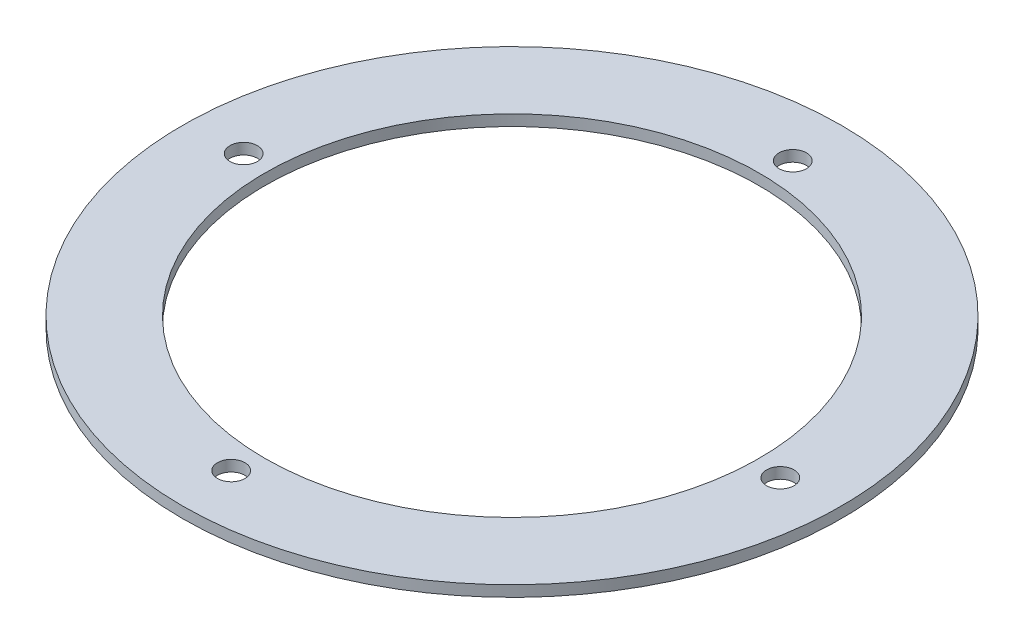
ISO-10303-21;
HEADER;
FILE_DESCRIPTION(('STEP AP214'),'2;1');
FILE_NAME('part.step','',(''),(''),'','','');
FILE_SCHEMA(('AUTOMOTIVE_DESIGN { 1 0 10303 214 1 1 1 1 }'));
ENDSEC;
DATA;
#1=APPLICATION_CONTEXT('core data for automotive mechanical design processes');
#2=APPLICATION_PROTOCOL_DEFINITION('international standard','automotive_design',2000,#1);
#3=PRODUCT_CONTEXT('',#1,'mechanical');
#4=PRODUCT('Part','Part','',(#3));
#5=PRODUCT_RELATED_PRODUCT_CATEGORY('part','',(#4));
#6=PRODUCT_DEFINITION_FORMATION('','',#4);
#7=PRODUCT_DEFINITION_CONTEXT('part definition',#1,'design');
#8=PRODUCT_DEFINITION('design','',#6,#7);
#9=PRODUCT_DEFINITION_SHAPE('','',#8);
#10=(LENGTH_UNIT() NAMED_UNIT(*) SI_UNIT(.MILLI.,.METRE.));
#11=(NAMED_UNIT(*) PLANE_ANGLE_UNIT() SI_UNIT($,.RADIAN.));
#12=(NAMED_UNIT(*) SI_UNIT($,.STERADIAN.) SOLID_ANGLE_UNIT());
#13=UNCERTAINTY_MEASURE_WITH_UNIT(LENGTH_MEASURE(1.E-05),#10,'distance_accuracy_value','');
#14=(GEOMETRIC_REPRESENTATION_CONTEXT(3) GLOBAL_UNCERTAINTY_ASSIGNED_CONTEXT((#13)) GLOBAL_UNIT_ASSIGNED_CONTEXT((#10,
#11,#12)) REPRESENTATION_CONTEXT('',''));
#15=CARTESIAN_POINT('',(0.,0.,0.));
#16=DIRECTION('',(0.,0.,1.));
#17=DIRECTION('',(1.,0.,0.));
#18=AXIS2_PLACEMENT_3D('',#15,#16,#17);
#19=CARTESIAN_POINT('',(0.,2.,0.));
#20=DIRECTION('',(0.,1.,0.));
#21=DIRECTION('',(0.,0.,1.));
#22=AXIS2_PLACEMENT_3D('',#19,#20,#21);
#23=PLANE('',#22);
#24=CARTESIAN_POINT('',(-1.13342940451287,2.,49.9871517270687));
#25=DIRECTION('',(0.,1.,0.));
#26=DIRECTION('',(0.,0.,1.));
#27=AXIS2_PLACEMENT_3D('',#24,#25,#26);
#28=CIRCLE('',#27,2.50000000000302);
#29=CARTESIAN_POINT('',(-1.13342940451287,2.,52.4871517270717));
#30=VERTEX_POINT('',#29);
#31=EDGE_CURVE('E60',#30,#30,#28,.T.);
#32=ORIENTED_EDGE('',*,*,#31,.F.);
#33=EDGE_LOOP('',(#32));
#34=FACE_BOUND('',#33,.T.);
#35=CARTESIAN_POINT('',(1.13342940451571,2.,-49.9871517270686));
#36=DIRECTION('',(0.,1.,0.));
#37=DIRECTION('',(0.,0.,1.));
#38=AXIS2_PLACEMENT_3D('',#35,#36,#37);
#39=CIRCLE('',#38,2.5);
#40=CARTESIAN_POINT('',(1.13342940451571,2.,-47.4871517270686));
#41=VERTEX_POINT('',#40);
#42=EDGE_CURVE('E48',#41,#41,#39,.T.);
#43=ORIENTED_EDGE('',*,*,#42,.F.);
#44=EDGE_LOOP('',(#43));
#45=FACE_BOUND('',#44,.T.);
#46=CARTESIAN_POINT('',(0.,2.,0.));
#47=DIRECTION('',(0.,1.,0.));
#48=DIRECTION('',(0.,0.,1.));
#49=AXIS2_PLACEMENT_3D('',#46,#47,#48);
#50=CIRCLE('',#49,60.);
#51=CARTESIAN_POINT('',(0.,2.,60.));
#52=VERTEX_POINT('',#51);
#53=EDGE_CURVE('E10',#52,#52,#50,.T.);
#54=ORIENTED_EDGE('',*,*,#53,.T.);
#55=EDGE_LOOP('',(#54));
#56=FACE_BOUND('',#55,.T.);
#57=CARTESIAN_POINT('',(0.,2.,0.));
#58=DIRECTION('',(0.,1.,0.));
#59=DIRECTION('',(0.,0.,1.));
#60=AXIS2_PLACEMENT_3D('',#57,#58,#59);
#61=CIRCLE('',#60,45.);
#62=CARTESIAN_POINT('',(0.,2.,45.));
#63=VERTEX_POINT('',#62);
#64=EDGE_CURVE('E43',#63,#63,#61,.T.);
#65=ORIENTED_EDGE('',*,*,#64,.F.);
#66=EDGE_LOOP('',(#65));
#67=FACE_BOUND('',#66,.T.);
#68=CARTESIAN_POINT('',(49.9871517270701,2.,1.13342940451432));
#69=DIRECTION('',(0.,1.,0.));
#70=DIRECTION('',(0.,0.,1.));
#71=AXIS2_PLACEMENT_3D('',#68,#69,#70);
#72=CIRCLE('',#71,2.50000000000107);
#73=CARTESIAN_POINT('',(49.9871517270701,2.,3.63342940451539));
#74=VERTEX_POINT('',#73);
#75=EDGE_CURVE('E54',#74,#74,#72,.T.);
#76=ORIENTED_EDGE('',*,*,#75,.F.);
#77=EDGE_LOOP('',(#76));
#78=FACE_BOUND('',#77,.T.);
#79=CARTESIAN_POINT('',(-49.9871517270672,2.,-1.13342940451425));
#80=DIRECTION('',(0.,1.,0.));
#81=DIRECTION('',(0.,0.,1.));
#82=AXIS2_PLACEMENT_3D('',#79,#80,#81);
#83=CIRCLE('',#82,2.5000000000023);
#84=CARTESIAN_POINT('',(-49.9871517270672,2.,1.36657059548805));
#85=VERTEX_POINT('',#84);
#86=EDGE_CURVE('E66',#85,#85,#83,.T.);
#87=ORIENTED_EDGE('',*,*,#86,.F.);
#88=EDGE_LOOP('',(#87));
#89=FACE_BOUND('',#88,.T.);
#90=ADVANCED_FACE('F32',(#34,#45,#56,#67,#78,#89),#23,.T.);
#91=CARTESIAN_POINT('',(0.,0.,0.));
#92=DIRECTION('',(0.,1.,0.));
#93=DIRECTION('',(0.,0.,1.));
#94=AXIS2_PLACEMENT_3D('',#91,#92,#93);
#95=PLANE('',#94);
#96=CARTESIAN_POINT('',(0.,0.,0.));
#97=DIRECTION('',(0.,1.,0.));
#98=DIRECTION('',(0.,0.,1.));
#99=AXIS2_PLACEMENT_3D('',#96,#97,#98);
#100=CIRCLE('',#99,60.);
#101=CARTESIAN_POINT('',(0.,0.,60.));
#102=VERTEX_POINT('',#101);
#103=EDGE_CURVE('E36',#102,#102,#100,.T.);
#104=ORIENTED_EDGE('',*,*,#103,.F.);
#105=EDGE_LOOP('',(#104));
#106=FACE_BOUND('',#105,.T.);
#107=CARTESIAN_POINT('',(0.,0.,0.));
#108=DIRECTION('',(0.,1.,0.));
#109=DIRECTION('',(0.,0.,1.));
#110=AXIS2_PLACEMENT_3D('',#107,#108,#109);
#111=CIRCLE('',#110,45.);
#112=CARTESIAN_POINT('',(0.,0.,45.));
#113=VERTEX_POINT('',#112);
#114=EDGE_CURVE('E45',#113,#113,#111,.T.);
#115=ORIENTED_EDGE('',*,*,#114,.T.);
#116=EDGE_LOOP('',(#115));
#117=FACE_BOUND('',#116,.T.);
#118=CARTESIAN_POINT('',(1.13342940451571,0.,-49.9871517270686));
#119=DIRECTION('',(0.,1.,0.));
#120=DIRECTION('',(0.,0.,1.));
#121=AXIS2_PLACEMENT_3D('',#118,#119,#120);
#122=CIRCLE('',#121,2.5);
#123=CARTESIAN_POINT('',(1.13342940451571,0.,-47.4871517270686));
#124=VERTEX_POINT('',#123);
#125=EDGE_CURVE('E51',#124,#124,#122,.T.);
#126=ORIENTED_EDGE('',*,*,#125,.T.);
#127=EDGE_LOOP('',(#126));
#128=FACE_BOUND('',#127,.T.);
#129=CARTESIAN_POINT('',(49.9871517270701,0.,1.13342940451432));
#130=DIRECTION('',(0.,1.,0.));
#131=DIRECTION('',(0.,0.,1.));
#132=AXIS2_PLACEMENT_3D('',#129,#130,#131);
#133=CIRCLE('',#132,2.50000000000107);
#134=CARTESIAN_POINT('',(49.9871517270701,0.,3.63342940451539));
#135=VERTEX_POINT('',#134);
#136=EDGE_CURVE('E57',#135,#135,#133,.T.);
#137=ORIENTED_EDGE('',*,*,#136,.T.);
#138=EDGE_LOOP('',(#137));
#139=FACE_BOUND('',#138,.T.);
#140=CARTESIAN_POINT('',(-1.13342940451287,0.,49.9871517270687));
#141=DIRECTION('',(0.,1.,0.));
#142=DIRECTION('',(0.,0.,1.));
#143=AXIS2_PLACEMENT_3D('',#140,#141,#142);
#144=CIRCLE('',#143,2.50000000000302);
#145=CARTESIAN_POINT('',(-1.13342940451287,0.,52.4871517270717));
#146=VERTEX_POINT('',#145);
#147=EDGE_CURVE('E63',#146,#146,#144,.T.);
#148=ORIENTED_EDGE('',*,*,#147,.T.);
#149=EDGE_LOOP('',(#148));
#150=FACE_BOUND('',#149,.T.);
#151=CARTESIAN_POINT('',(-49.9871517270672,0.,-1.13342940451425));
#152=DIRECTION('',(0.,1.,0.));
#153=DIRECTION('',(0.,0.,1.));
#154=AXIS2_PLACEMENT_3D('',#151,#152,#153);
#155=CIRCLE('',#154,2.5000000000023);
#156=CARTESIAN_POINT('',(-49.9871517270672,0.,1.36657059548805));
#157=VERTEX_POINT('',#156);
#158=EDGE_CURVE('E69',#157,#157,#155,.T.);
#159=ORIENTED_EDGE('',*,*,#158,.T.);
#160=EDGE_LOOP('',(#159));
#161=FACE_BOUND('',#160,.T.);
#162=ADVANCED_FACE('F79',(#106,#117,#128,#139,#150,#161),#95,.F.);
#163=CARTESIAN_POINT('',(0.,2.,0.));
#164=DIRECTION('',(0.,-1.,0.));
#165=DIRECTION('',(0.,0.,-1.));
#166=AXIS2_PLACEMENT_3D('',#163,#164,#165);
#167=CYLINDRICAL_SURFACE('',#166,60.);
#168=ORIENTED_EDGE('',*,*,#53,.F.);
#169=EDGE_LOOP('',(#168));
#170=FACE_BOUND('',#169,.T.);
#171=ORIENTED_EDGE('',*,*,#103,.T.);
#172=EDGE_LOOP('',(#171));
#173=FACE_BOUND('',#172,.T.);
#174=ADVANCED_FACE('F34',(#170,#173),#167,.T.);
#175=CARTESIAN_POINT('',(0.,2.,0.));
#176=DIRECTION('',(0.,-1.,0.));
#177=DIRECTION('',(0.,0.,-1.));
#178=AXIS2_PLACEMENT_3D('',#175,#176,#177);
#179=CYLINDRICAL_SURFACE('',#178,45.);
#180=ORIENTED_EDGE('',*,*,#64,.T.);
#181=EDGE_LOOP('',(#180));
#182=FACE_BOUND('',#181,.T.);
#183=ORIENTED_EDGE('',*,*,#114,.F.);
#184=EDGE_LOOP('',(#183));
#185=FACE_BOUND('',#184,.T.);
#186=ADVANCED_FACE('F89',(#182,#185),#179,.F.);
#187=CARTESIAN_POINT('',(1.13342940451571,2.,-49.9871517270686));
#188=DIRECTION('',(0.,-1.,0.));
#189=DIRECTION('',(0.,0.,-1.));
#190=AXIS2_PLACEMENT_3D('',#187,#188,#189);
#191=CYLINDRICAL_SURFACE('',#190,2.5);
#192=ORIENTED_EDGE('',*,*,#42,.T.);
#193=EDGE_LOOP('',(#192));
#194=FACE_BOUND('',#193,.T.);
#195=ORIENTED_EDGE('',*,*,#125,.F.);
#196=EDGE_LOOP('',(#195));
#197=FACE_BOUND('',#196,.T.);
#198=ADVANCED_FACE('F92',(#194,#197),#191,.F.);
#199=CARTESIAN_POINT('',(49.9871517270701,2.,1.13342940451432));
#200=DIRECTION('',(0.,-1.,0.));
#201=DIRECTION('',(0.,0.,-1.));
#202=AXIS2_PLACEMENT_3D('',#199,#200,#201);
#203=CYLINDRICAL_SURFACE('',#202,2.50000000000107);
#204=ORIENTED_EDGE('',*,*,#75,.T.);
#205=EDGE_LOOP('',(#204));
#206=FACE_BOUND('',#205,.T.);
#207=ORIENTED_EDGE('',*,*,#136,.F.);
#208=EDGE_LOOP('',(#207));
#209=FACE_BOUND('',#208,.T.);
#210=ADVANCED_FACE('F96',(#206,#209),#203,.F.);
#211=CARTESIAN_POINT('',(-1.13342940451287,2.,49.9871517270687));
#212=DIRECTION('',(0.,-1.,0.));
#213=DIRECTION('',(0.,0.,-1.));
#214=AXIS2_PLACEMENT_3D('',#211,#212,#213);
#215=CYLINDRICAL_SURFACE('',#214,2.50000000000302);
#216=ORIENTED_EDGE('',*,*,#31,.T.);
#217=EDGE_LOOP('',(#216));
#218=FACE_BOUND('',#217,.T.);
#219=ORIENTED_EDGE('',*,*,#147,.F.);
#220=EDGE_LOOP('',(#219));
#221=FACE_BOUND('',#220,.T.);
#222=ADVANCED_FACE('F100',(#218,#221),#215,.F.);
#223=CARTESIAN_POINT('',(-49.9871517270672,2.,-1.13342940451425));
#224=DIRECTION('',(0.,-1.,0.));
#225=DIRECTION('',(0.,0.,-1.));
#226=AXIS2_PLACEMENT_3D('',#223,#224,#225);
#227=CYLINDRICAL_SURFACE('',#226,2.5000000000023);
#228=ORIENTED_EDGE('',*,*,#86,.T.);
#229=EDGE_LOOP('',(#228));
#230=FACE_BOUND('',#229,.T.);
#231=ORIENTED_EDGE('',*,*,#158,.F.);
#232=EDGE_LOOP('',(#231));
#233=FACE_BOUND('',#232,.T.);
#234=ADVANCED_FACE('F75',(#230,#233),#227,.F.);
#235=CLOSED_SHELL('',(#90,#162,#174,#186,#198,#210,#222,#234));
#236=MANIFOLD_SOLID_BREP('B2',#235);
#237=ADVANCED_BREP_SHAPE_REPRESENTATION('',(#18,#236),#14);
#238=SHAPE_DEFINITION_REPRESENTATION(#9,#237);
ENDSEC;
END-ISO-10303-21;
